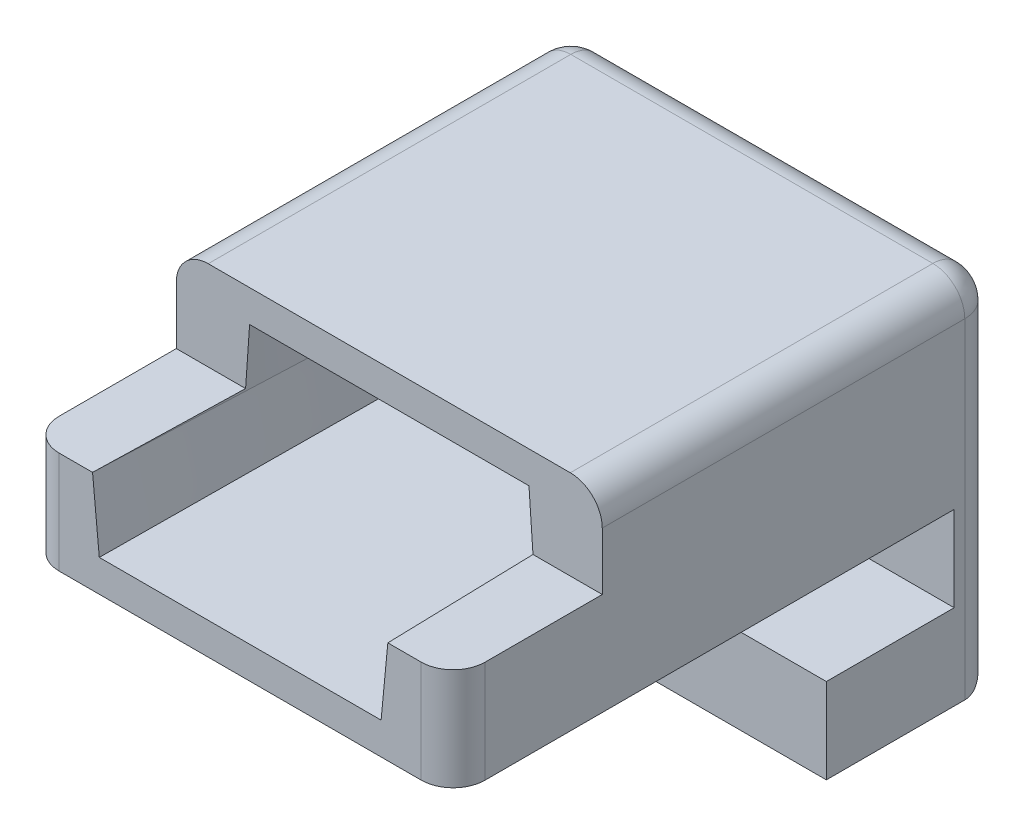
ISO-10303-21;
HEADER;
FILE_DESCRIPTION(('STEP AP214'),'2;1');
FILE_NAME('part.step','',(''),(''),'','','');
FILE_SCHEMA(('AUTOMOTIVE_DESIGN { 1 0 10303 214 1 1 1 1 }'));
ENDSEC;
DATA;
#1=APPLICATION_CONTEXT('core data for automotive mechanical design processes');
#2=APPLICATION_PROTOCOL_DEFINITION('international standard','automotive_design',2000,#1);
#3=PRODUCT_CONTEXT('',#1,'mechanical');
#4=PRODUCT('Part','Part','',(#3));
#5=PRODUCT_RELATED_PRODUCT_CATEGORY('part','',(#4));
#6=PRODUCT_DEFINITION_FORMATION('','',#4);
#7=PRODUCT_DEFINITION_CONTEXT('part definition',#1,'design');
#8=PRODUCT_DEFINITION('design','',#6,#7);
#9=PRODUCT_DEFINITION_SHAPE('','',#8);
#10=(LENGTH_UNIT() NAMED_UNIT(*) SI_UNIT(.MILLI.,.METRE.));
#11=(NAMED_UNIT(*) PLANE_ANGLE_UNIT() SI_UNIT($,.RADIAN.));
#12=(NAMED_UNIT(*) SI_UNIT($,.STERADIAN.) SOLID_ANGLE_UNIT());
#13=UNCERTAINTY_MEASURE_WITH_UNIT(LENGTH_MEASURE(1.E-05),#10,'distance_accuracy_value','');
#14=(GEOMETRIC_REPRESENTATION_CONTEXT(3) GLOBAL_UNCERTAINTY_ASSIGNED_CONTEXT((#13)) GLOBAL_UNIT_ASSIGNED_CONTEXT((#10,
#11,#12)) REPRESENTATION_CONTEXT('',''));
#15=CARTESIAN_POINT('',(0.,0.,0.));
#16=DIRECTION('',(0.,0.,1.));
#17=DIRECTION('',(1.,0.,0.));
#18=AXIS2_PLACEMENT_3D('',#15,#16,#17);
#19=CARTESIAN_POINT('',(31.75,28.575,29.36875));
#20=DIRECTION('',(-1.,0.,0.));
#21=DIRECTION('',(0.,0.,1.));
#22=AXIS2_PLACEMENT_3D('',#19,#20,#21);
#23=PLANE('',#22);
#24=DIRECTION('',(0.,0.,1.));
#25=VECTOR('',#24,1.);
#26=CARTESIAN_POINT('',(31.75,-25.4,-51.66233));
#27=LINE('',#26,#25);
#28=CARTESIAN_POINT('',(31.75,-25.4,-46.89983));
#29=VERTEX_POINT('',#28);
#30=CARTESIAN_POINT('',(31.75,-25.4,-26.26233));
#31=VERTEX_POINT('',#30);
#32=EDGE_CURVE('E247',#29,#31,#27,.T.);
#33=ORIENTED_EDGE('',*,*,#32,.F.);
#34=DIRECTION('',(0.,-1.,0.));
#35=VECTOR('',#34,1.);
#36=CARTESIAN_POINT('',(31.75,28.575,-46.89983));
#37=LINE('',#36,#35);
#38=CARTESIAN_POINT('',(31.75,23.8125,-46.89983));
#39=VERTEX_POINT('',#38);
#40=EDGE_CURVE('E14',#29,#39,#37,.F.);
#41=ORIENTED_EDGE('',*,*,#40,.T.);
#42=DIRECTION('',(0.,0.,-1.));
#43=VECTOR('',#42,1.);
#44=CARTESIAN_POINT('',(31.75,23.8125,29.36875));
#45=LINE('',#44,#43);
#46=CARTESIAN_POINT('',(31.75,23.8125,7.14374999999994));
#47=VERTEX_POINT('',#46);
#48=EDGE_CURVE('E72',#39,#47,#45,.F.);
#49=ORIENTED_EDGE('',*,*,#48,.T.);
#50=DIRECTION('',(0.,1.,0.));
#51=VECTOR('',#50,1.);
#52=CARTESIAN_POINT('',(31.75,-67.2770438188243,7.14375));
#53=LINE('',#52,#51);
#54=CARTESIAN_POINT('',(31.75,15.24,7.14375));
#55=VERTEX_POINT('',#54);
#56=EDGE_CURVE('E556',#55,#47,#53,.T.);
#57=ORIENTED_EDGE('',*,*,#56,.F.);
#58=DIRECTION('',(0.,0.,-1.));
#59=VECTOR('',#58,1.);
#60=CARTESIAN_POINT('',(31.75,15.24,7.14375));
#61=LINE('',#60,#59);
#62=CARTESIAN_POINT('',(31.75,15.24,24.60625));
#63=VERTEX_POINT('',#62);
#64=EDGE_CURVE('E394',#63,#55,#61,.T.);
#65=ORIENTED_EDGE('',*,*,#64,.F.);
#66=DIRECTION('',(0.,-1.,0.));
#67=VECTOR('',#66,1.);
#68=CARTESIAN_POINT('',(31.75,28.575,24.60625));
#69=LINE('',#68,#67);
#70=CARTESIAN_POINT('',(31.75,0.,24.60625));
#71=VERTEX_POINT('',#70);
#72=EDGE_CURVE('E382',#63,#71,#69,.T.);
#73=ORIENTED_EDGE('',*,*,#72,.T.);
#74=DIRECTION('',(0.,0.,-1.));
#75=VECTOR('',#74,1.);
#76=CARTESIAN_POINT('',(31.75,0.,29.36875));
#77=LINE('',#76,#75);
#78=CARTESIAN_POINT('',(31.75,0.,-45.31233));
#79=VERTEX_POINT('',#78);
#80=EDGE_CURVE('E252',#71,#79,#77,.T.);
#81=ORIENTED_EDGE('',*,*,#80,.T.);
#82=DIRECTION('',(0.,-1.,0.));
#83=VECTOR('',#82,1.);
#84=CARTESIAN_POINT('',(31.75,0.,-45.31233));
#85=LINE('',#84,#83);
#86=CARTESIAN_POINT('',(31.75,-12.7,-45.31233));
#87=VERTEX_POINT('',#86);
#88=EDGE_CURVE('E234',#79,#87,#85,.T.);
#89=ORIENTED_EDGE('',*,*,#88,.T.);
#90=DIRECTION('',(0.,0.,1.));
#91=VECTOR('',#90,1.);
#92=CARTESIAN_POINT('',(31.75,-12.7,-45.31233));
#93=LINE('',#92,#91);
#94=CARTESIAN_POINT('',(31.75,-12.7,-26.26233));
#95=VERTEX_POINT('',#94);
#96=EDGE_CURVE('E241',#87,#95,#93,.T.);
#97=ORIENTED_EDGE('',*,*,#96,.T.);
#98=DIRECTION('',(0.,1.,0.));
#99=VECTOR('',#98,1.);
#100=CARTESIAN_POINT('',(31.75,-25.4,-26.26233));
#101=LINE('',#100,#99);
#102=EDGE_CURVE('E270',#31,#95,#101,.T.);
#103=ORIENTED_EDGE('',*,*,#102,.F.);
#104=EDGE_LOOP('',(#33,#41,#49,#57,#65,#73,#81,#89,#97,#103));
#105=FACE_BOUND('',#104,.T.);
#106=ADVANCED_FACE('F63',(#105),#23,.F.);
#107=CARTESIAN_POINT('',(-31.75,28.575,29.36875));
#108=DIRECTION('',(1.,0.,0.));
#109=DIRECTION('',(0.,0.,-1.));
#110=AXIS2_PLACEMENT_3D('',#107,#108,#109);
#111=PLANE('',#110);
#112=DIRECTION('',(0.,0.,1.));
#113=VECTOR('',#112,1.);
#114=CARTESIAN_POINT('',(-31.75,23.8125,29.36875));
#115=LINE('',#114,#113);
#116=CARTESIAN_POINT('',(-31.75,23.8125,7.14374999999994));
#117=VERTEX_POINT('',#116);
#118=CARTESIAN_POINT('',(-31.75,23.8125,-46.89983));
#119=VERTEX_POINT('',#118);
#120=EDGE_CURVE('E426',#117,#119,#115,.F.);
#121=ORIENTED_EDGE('',*,*,#120,.T.);
#122=DIRECTION('',(0.,1.,0.));
#123=VECTOR('',#122,1.);
#124=CARTESIAN_POINT('',(-31.75,-25.4,-46.89983));
#125=LINE('',#124,#123);
#126=CARTESIAN_POINT('',(-31.75,-25.4,-46.89983));
#127=VERTEX_POINT('',#126);
#128=EDGE_CURVE('E428',#119,#127,#125,.F.);
#129=ORIENTED_EDGE('',*,*,#128,.T.);
#130=DIRECTION('',(0.,0.,-1.));
#131=VECTOR('',#130,1.);
#132=CARTESIAN_POINT('',(-31.75,-25.4,-51.66233));
#133=LINE('',#132,#131);
#134=CARTESIAN_POINT('',(-31.75,-25.4,-26.26233));
#135=VERTEX_POINT('',#134);
#136=EDGE_CURVE('E264',#135,#127,#133,.T.);
#137=ORIENTED_EDGE('',*,*,#136,.F.);
#138=DIRECTION('',(0.,1.,0.));
#139=VECTOR('',#138,1.);
#140=CARTESIAN_POINT('',(-31.75,-25.4,-26.26233));
#141=LINE('',#140,#139);
#142=CARTESIAN_POINT('',(-31.75,-12.7,-26.26233));
#143=VERTEX_POINT('',#142);
#144=EDGE_CURVE('E267',#135,#143,#141,.T.);
#145=ORIENTED_EDGE('',*,*,#144,.T.);
#146=DIRECTION('',(0.,0.,1.));
#147=VECTOR('',#146,1.);
#148=CARTESIAN_POINT('',(-31.75,-12.7,-45.31233));
#149=LINE('',#148,#147);
#150=CARTESIAN_POINT('',(-31.75,-12.7,-45.31233));
#151=VERTEX_POINT('',#150);
#152=EDGE_CURVE('E248',#151,#143,#149,.T.);
#153=ORIENTED_EDGE('',*,*,#152,.F.);
#154=DIRECTION('',(0.,1.,0.));
#155=VECTOR('',#154,1.);
#156=CARTESIAN_POINT('',(-31.75,-12.7,-45.31233));
#157=LINE('',#156,#155);
#158=CARTESIAN_POINT('',(-31.75,0.,-45.31233));
#159=VERTEX_POINT('',#158);
#160=EDGE_CURVE('E236',#151,#159,#157,.T.);
#161=ORIENTED_EDGE('',*,*,#160,.T.);
#162=DIRECTION('',(0.,0.,1.));
#163=VECTOR('',#162,1.);
#164=CARTESIAN_POINT('',(-31.75,0.,29.36875));
#165=LINE('',#164,#163);
#166=CARTESIAN_POINT('',(-31.75,0.,24.60625));
#167=VERTEX_POINT('',#166);
#168=EDGE_CURVE('E485',#159,#167,#165,.T.);
#169=ORIENTED_EDGE('',*,*,#168,.T.);
#170=DIRECTION('',(0.,-1.,0.));
#171=VECTOR('',#170,1.);
#172=CARTESIAN_POINT('',(-31.75,28.575,24.60625));
#173=LINE('',#172,#171);
#174=CARTESIAN_POINT('',(-31.75,15.24,24.60625));
#175=VERTEX_POINT('',#174);
#176=EDGE_CURVE('E410',#167,#175,#173,.F.);
#177=ORIENTED_EDGE('',*,*,#176,.T.);
#178=DIRECTION('',(0.,0.,1.));
#179=VECTOR('',#178,1.);
#180=CARTESIAN_POINT('',(-31.75,15.24,7.14375));
#181=LINE('',#180,#179);
#182=CARTESIAN_POINT('',(-31.75,15.24,7.14375));
#183=VERTEX_POINT('',#182);
#184=EDGE_CURVE('E388',#183,#175,#181,.T.);
#185=ORIENTED_EDGE('',*,*,#184,.F.);
#186=DIRECTION('',(0.,1.,0.));
#187=VECTOR('',#186,1.);
#188=CARTESIAN_POINT('',(-31.75,-67.2770438188243,7.14375));
#189=LINE('',#188,#187);
#190=EDGE_CURVE('E553',#183,#117,#189,.T.);
#191=ORIENTED_EDGE('',*,*,#190,.T.);
#192=EDGE_LOOP('',(#121,#129,#137,#145,#153,#161,#169,#177,#185,#191));
#193=FACE_BOUND('',#192,.T.);
#194=ADVANCED_FACE('F475',(#193),#111,.F.);
#195=CARTESIAN_POINT('',(31.75,-25.4,-26.26233));
#196=DIRECTION('',(0.,0.,-1.));
#197=DIRECTION('',(-1.,0.,0.));
#198=AXIS2_PLACEMENT_3D('',#195,#196,#197);
#199=PLANE('',#198);
#200=DIRECTION('',(-1.,0.,0.));
#201=VECTOR('',#200,1.);
#202=CARTESIAN_POINT('',(31.75,-12.7,-26.26233));
#203=LINE('',#202,#201);
#204=EDGE_CURVE('E244',#95,#143,#203,.T.);
#205=ORIENTED_EDGE('',*,*,#204,.T.);
#206=ORIENTED_EDGE('',*,*,#144,.F.);
#207=DIRECTION('',(-1.,0.,0.));
#208=VECTOR('',#207,1.);
#209=CARTESIAN_POINT('',(31.75,-25.4,-26.26233));
#210=LINE('',#209,#208);
#211=EDGE_CURVE('E262',#31,#135,#210,.T.);
#212=ORIENTED_EDGE('',*,*,#211,.F.);
#213=ORIENTED_EDGE('',*,*,#102,.T.);
#214=EDGE_LOOP('',(#205,#206,#212,#213));
#215=FACE_BOUND('',#214,.T.);
#216=ADVANCED_FACE('F483',(#215),#199,.F.);
#217=CARTESIAN_POINT('',(0.,15.24,0.));
#218=DIRECTION('',(0.,-1.,0.));
#219=DIRECTION('',(0.,0.,-1.));
#220=AXIS2_PLACEMENT_3D('',#217,#218,#219);
#221=PLANE('',#220);
#222=DIRECTION('',(1.,0.,0.));
#223=VECTOR('',#222,1.);
#224=CARTESIAN_POINT('',(-31.75,15.24,29.36875));
#225=LINE('',#224,#223);
#226=CARTESIAN_POINT('',(22.0091,15.24,29.36875));
#227=VERTEX_POINT('',#226);
#228=CARTESIAN_POINT('',(26.9875,15.24,29.36875));
#229=VERTEX_POINT('',#228);
#230=EDGE_CURVE('E383',#227,#229,#225,.T.);
#231=ORIENTED_EDGE('',*,*,#230,.T.);
#232=CARTESIAN_POINT('',(26.9875,15.24,24.60625));
#233=DIRECTION('',(0.,-1.,0.));
#234=DIRECTION('',(0.,0.,-1.));
#235=AXIS2_PLACEMENT_3D('',#232,#233,#234);
#236=CIRCLE('',#235,4.7625);
#237=EDGE_CURVE('E408',#229,#63,#236,.F.);
#238=ORIENTED_EDGE('',*,*,#237,.T.);
#239=ORIENTED_EDGE('',*,*,#64,.T.);
#240=DIRECTION('',(-1.,0.,0.));
#241=VECTOR('',#240,1.);
#242=CARTESIAN_POINT('',(-31.75,15.24,7.14375));
#243=LINE('',#242,#241);
#244=CARTESIAN_POINT('',(21.4217049692344,15.24,7.14375));
#245=VERTEX_POINT('',#244);
#246=EDGE_CURVE('E551',#55,#245,#243,.T.);
#247=ORIENTED_EDGE('',*,*,#246,.T.);
#248=CARTESIAN_POINT('',(21.4217049692344,15.24,7.14375));
#249=CARTESIAN_POINT('',(21.5032600398479,15.24,10.3177035377856));
#250=CARTESIAN_POINT('',(21.5857706019446,15.24,13.4916326566718));
#251=CARTESIAN_POINT('',(21.7528116917226,15.24,19.8394369407282));
#252=CARTESIAN_POINT('',(21.8373422189032,15.24,23.0133121059116));
#253=CARTESIAN_POINT('',(21.9515386265982,15.24,27.2476922520784));
#254=CARTESIAN_POINT('',(21.9802588686799,15.24,28.3082227713538));
#255=CARTESIAN_POINT('',(22.0091,15.24,29.36875));
#256=B_SPLINE_CURVE_WITH_KNOTS('',3,(#248,#249,#250,#251,#252,#253,#254,#255),.UNSPECIFIED.,.F.,
.F.,(4,2,2,4),(0.,9.52500352563981,19.0500046905378,22.2327626687833),.UNSPECIFIED.);
#257=EDGE_CURVE('E316',#245,#227,#256,.T.);
#258=ORIENTED_EDGE('',*,*,#257,.T.);
#259=EDGE_LOOP('',(#231,#238,#239,#247,#258));
#260=FACE_BOUND('',#259,.T.);
#261=ADVANCED_FACE('F561',(#260),#221,.F.);
#262=CARTESIAN_POINT('',(-31.75,28.575,29.36875));
#263=DIRECTION('',(0.,0.,-1.));
#264=DIRECTION('',(-1.,0.,0.));
#265=AXIS2_PLACEMENT_3D('',#262,#263,#264);
#266=PLANE('',#265);
#267=DIRECTION('',(1.,0.,0.));
#268=VECTOR('',#267,1.);
#269=CARTESIAN_POINT('',(-31.75,0.,29.36875));
#270=LINE('',#269,#268);
#271=CARTESIAN_POINT('',(-26.9875,0.,29.36875));
#272=VERTEX_POINT('',#271);
#273=CARTESIAN_POINT('',(26.9875,0.,29.36875));
#274=VERTEX_POINT('',#273);
#275=EDGE_CURVE('E364',#272,#274,#270,.T.);
#276=ORIENTED_EDGE('',*,*,#275,.T.);
#277=DIRECTION('',(0.,-1.,0.));
#278=VECTOR('',#277,1.);
#279=CARTESIAN_POINT('',(26.9875,28.575,29.36875));
#280=LINE('',#279,#278);
#281=EDGE_CURVE('E406',#274,#229,#280,.F.);
#282=ORIENTED_EDGE('',*,*,#281,.T.);
#283=ORIENTED_EDGE('',*,*,#230,.F.);
#284=DIRECTION('',(0.0953215469228855,0.995446534321271,0.));
#285=VECTOR('',#284,1.);
#286=CARTESIAN_POINT('',(21.0058,4.76249999999998,29.36875));
#287=LINE('',#286,#285);
#288=CARTESIAN_POINT('',(21.0058,4.76249999999998,29.36875));
#289=VERTEX_POINT('',#288);
#290=EDGE_CURVE('E389',#289,#227,#287,.T.);
#291=ORIENTED_EDGE('',*,*,#290,.F.);
#292=DIRECTION('',(1.,0.,0.));
#293=VECTOR('',#292,1.);
#294=CARTESIAN_POINT('',(-21.0058,4.76249999999998,29.36875));
#295=LINE('',#294,#293);
#296=CARTESIAN_POINT('',(-21.0058,4.76249999999998,29.36875));
#297=VERTEX_POINT('',#296);
#298=EDGE_CURVE('E299',#297,#289,#295,.T.);
#299=ORIENTED_EDGE('',*,*,#298,.F.);
#300=DIRECTION('',(0.0953215469228855,-0.995446534321271,0.));
#301=VECTOR('',#300,1.);
#302=CARTESIAN_POINT('',(-21.0058,4.76249999999998,29.36875));
#303=LINE('',#302,#301);
#304=CARTESIAN_POINT('',(-22.0091,15.24,29.36875));
#305=VERTEX_POINT('',#304);
#306=EDGE_CURVE('E505',#305,#297,#303,.T.);
#307=ORIENTED_EDGE('',*,*,#306,.F.);
#308=CARTESIAN_POINT('',(-26.9875,15.24,29.36875));
#309=VERTEX_POINT('',#308);
#310=EDGE_CURVE('E387',#309,#305,#225,.T.);
#311=ORIENTED_EDGE('',*,*,#310,.F.);
#312=DIRECTION('',(0.,-1.,0.));
#313=VECTOR('',#312,1.);
#314=CARTESIAN_POINT('',(-26.9875,28.575,29.36875));
#315=LINE('',#314,#313);
#316=EDGE_CURVE('E403',#309,#272,#315,.T.);
#317=ORIENTED_EDGE('',*,*,#316,.T.);
#318=EDGE_LOOP('',(#276,#282,#283,#291,#299,#307,#311,#317));
#319=FACE_BOUND('',#318,.T.);
#320=ADVANCED_FACE('F501',(#319),#266,.F.);
#321=CARTESIAN_POINT('',(0.,28.575,0.));
#322=DIRECTION('',(0.,-1.,0.));
#323=DIRECTION('',(0.,0.,-1.));
#324=AXIS2_PLACEMENT_3D('',#321,#322,#323);
#325=PLANE('',#324);
#326=DIRECTION('',(1.,0.,0.));
#327=VECTOR('',#326,1.);
#328=CARTESIAN_POINT('',(-31.75,28.575,-46.89983));
#329=LINE('',#328,#327);
#330=CARTESIAN_POINT('',(26.9875,28.575,-46.89983));
#331=VERTEX_POINT('',#330);
#332=CARTESIAN_POINT('',(-26.9875,28.575,-46.89983));
#333=VERTEX_POINT('',#332);
#334=EDGE_CURVE('E432',#331,#333,#329,.F.);
#335=ORIENTED_EDGE('',*,*,#334,.T.);
#336=DIRECTION('',(0.,0.,1.));
#337=VECTOR('',#336,1.);
#338=CARTESIAN_POINT('',(-26.9875,28.575,0.));
#339=LINE('',#338,#337);
#340=CARTESIAN_POINT('',(-26.9875,28.575,7.14375));
#341=VERTEX_POINT('',#340);
#342=EDGE_CURVE('E434',#333,#341,#339,.T.);
#343=ORIENTED_EDGE('',*,*,#342,.T.);
#344=DIRECTION('',(-1.,0.,0.));
#345=VECTOR('',#344,1.);
#346=CARTESIAN_POINT('',(-31.75,28.575,7.14375));
#347=LINE('',#346,#345);
#348=CARTESIAN_POINT('',(26.9875,28.575,7.14375));
#349=VERTEX_POINT('',#348);
#350=EDGE_CURVE('E552',#349,#341,#347,.T.);
#351=ORIENTED_EDGE('',*,*,#350,.F.);
#352=DIRECTION('',(0.,0.,-1.));
#353=VECTOR('',#352,1.);
#354=CARTESIAN_POINT('',(26.9875,28.575,0.));
#355=LINE('',#354,#353);
#356=EDGE_CURVE('E430',#349,#331,#355,.T.);
#357=ORIENTED_EDGE('',*,*,#356,.T.);
#358=EDGE_LOOP('',(#335,#343,#351,#357));
#359=FACE_BOUND('',#358,.T.);
#360=ADVANCED_FACE('F640',(#359),#325,.F.);
#361=CARTESIAN_POINT('',(0.,0.,0.));
#362=DIRECTION('',(0.,-1.,0.));
#363=DIRECTION('',(0.,0.,-1.));
#364=AXIS2_PLACEMENT_3D('',#361,#362,#363);
#365=PLANE('',#364);
#366=ORIENTED_EDGE('',*,*,#80,.F.);
#367=CARTESIAN_POINT('',(26.9875,0.,24.60625));
#368=DIRECTION('',(0.,-1.,0.));
#369=DIRECTION('',(0.,0.,-1.));
#370=AXIS2_PLACEMENT_3D('',#367,#368,#369);
#371=CIRCLE('',#370,4.7625);
#372=EDGE_CURVE('E401',#71,#274,#371,.T.);
#373=ORIENTED_EDGE('',*,*,#372,.T.);
#374=ORIENTED_EDGE('',*,*,#275,.F.);
#375=CARTESIAN_POINT('',(-26.9875,0.,24.60625));
#376=DIRECTION('',(0.,-1.,0.));
#377=DIRECTION('',(0.,0.,-1.));
#378=AXIS2_PLACEMENT_3D('',#375,#376,#377);
#379=CIRCLE('',#378,4.7625);
#380=EDGE_CURVE('E494',#272,#167,#379,.T.);
#381=ORIENTED_EDGE('',*,*,#380,.T.);
#382=ORIENTED_EDGE('',*,*,#168,.F.);
#383=DIRECTION('',(1.,0.,0.));
#384=VECTOR('',#383,1.);
#385=CARTESIAN_POINT('',(-31.75,0.,-45.31233));
#386=LINE('',#385,#384);
#387=EDGE_CURVE('E258',#159,#79,#386,.T.);
#388=ORIENTED_EDGE('',*,*,#387,.T.);
#389=EDGE_LOOP('',(#366,#373,#374,#381,#382,#388));
#390=FACE_BOUND('',#389,.T.);
#391=ADVANCED_FACE('F650',(#390),#365,.T.);
#392=ORIENTED_EDGE('',*,*,#184,.T.);
#393=CARTESIAN_POINT('',(-26.9875,15.24,24.60625));
#394=DIRECTION('',(0.,-1.,0.));
#395=DIRECTION('',(0.,0.,-1.));
#396=AXIS2_PLACEMENT_3D('',#393,#394,#395);
#397=CIRCLE('',#396,4.7625);
#398=EDGE_CURVE('E412',#175,#309,#397,.F.);
#399=ORIENTED_EDGE('',*,*,#398,.T.);
#400=ORIENTED_EDGE('',*,*,#310,.T.);
#401=CARTESIAN_POINT('',(-22.0091,15.24,29.36875));
#402=CARTESIAN_POINT('',(-21.9227886213007,15.24,26.1949220887347));
#403=CARTESIAN_POINT('',(-21.8375584750906,15.24,23.0210648125797));
#404=CARTESIAN_POINT('',(-21.6691541888226,15.24,16.6732964458658));
#405=CARTESIAN_POINT('',(-21.5859800482842,15.24,13.4993853553197));
#406=CARTESIAN_POINT('',(-21.4763139235597,15.24,9.2648855024364));
#407=CARTESIAN_POINT('',(-21.4489560216459,15.24,8.20431911865208));
#408=CARTESIAN_POINT('',(-21.4217049692344,15.24,7.14375));
#409=B_SPLINE_CURVE_WITH_KNOTS('',3,(#401,#402,#403,#404,#405,#406,#407,#408),.UNSPECIFIED.,.F.,
.F.,(4,2,2,4),(0.,9.52500368368208,19.0500051412578,22.2327626584923),.UNSPECIFIED.);
#410=CARTESIAN_POINT('',(-21.4217049692344,15.24,7.14375));
#411=VERTEX_POINT('',#410);
#412=EDGE_CURVE('E313',#305,#411,#409,.T.);
#413=ORIENTED_EDGE('',*,*,#412,.T.);
#414=EDGE_CURVE('E549',#411,#183,#243,.T.);
#415=ORIENTED_EDGE('',*,*,#414,.T.);
#416=EDGE_LOOP('',(#392,#399,#400,#413,#415));
#417=FACE_BOUND('',#416,.T.);
#418=ADVANCED_FACE('F327',(#417),#221,.F.);
#419=CARTESIAN_POINT('',(-31.75,-67.2770438188243,7.14375));
#420=DIRECTION('',(0.,0.,-1.));
#421=DIRECTION('',(-1.,0.,0.));
#422=AXIS2_PLACEMENT_3D('',#419,#420,#421);
#423=PLANE('',#422);
#424=ORIENTED_EDGE('',*,*,#350,.T.);
#425=CARTESIAN_POINT('',(-26.9875,23.8125,7.14375000000006));
#426=DIRECTION('',(0.,0.,-1.));
#427=DIRECTION('',(0.,1.,0.));
#428=AXIS2_PLACEMENT_3D('',#425,#426,#427);
#429=CIRCLE('',#428,4.7625);
#430=EDGE_CURVE('E438',#341,#117,#429,.F.);
#431=ORIENTED_EDGE('',*,*,#430,.T.);
#432=ORIENTED_EDGE('',*,*,#190,.F.);
#433=ORIENTED_EDGE('',*,*,#414,.F.);
#434=CARTESIAN_POINT('',(-21.4217049692344,15.24,7.14375));
#435=CARTESIAN_POINT('',(-21.3664219162519,16.0318224842431,7.14375));
#436=CARTESIAN_POINT('',(-21.3111388632694,16.8236449684862,7.14375));
#437=CARTESIAN_POINT('',(-21.2005727573043,18.4072899369725,7.14375));
#438=CARTESIAN_POINT('',(-21.1452897043218,19.1991124212156,7.14375));
#439=CARTESIAN_POINT('',(-21.0010692990911,21.2647899369725,7.14375));
#440=CARTESIAN_POINT('',(-20.9121319468429,22.5386449684862,7.14375));
#441=CARTESIAN_POINT('',(-20.8231945945946,23.8125,7.14375));
#442=B_SPLINE_CURVE_WITH_KNOTS('',3,(#434,#435,#436,#437,#438,#439,#440,#441),.UNSPECIFIED.,.F.,
.F.,(4,2,2,4),(0.,2.38125000000004,4.76250000000007,8.593367844946),.UNSPECIFIED.);
#443=CARTESIAN_POINT('',(-20.8231945945946,23.8125,7.14375));
#444=VERTEX_POINT('',#443);
#445=EDGE_CURVE('E355',#411,#444,#442,.T.);
#446=ORIENTED_EDGE('',*,*,#445,.T.);
#447=DIRECTION('',(1.,0.,0.));
#448=VECTOR('',#447,1.);
#449=CARTESIAN_POINT('',(-31.75,23.8125,7.14375));
#450=LINE('',#449,#448);
#451=CARTESIAN_POINT('',(20.8231945945946,23.8125,7.14375));
#452=VERTEX_POINT('',#451);
#453=EDGE_CURVE('E363',#444,#452,#450,.T.);
#454=ORIENTED_EDGE('',*,*,#453,.T.);
#455=CARTESIAN_POINT('',(20.8231945945946,23.8125,7.14375));
#456=CARTESIAN_POINT('',(20.8784776475771,23.0206775157569,7.14375));
#457=CARTESIAN_POINT('',(20.9337607005596,22.2288550315138,7.14375));
#458=CARTESIAN_POINT('',(21.0443268065246,20.6452100630275,7.14375));
#459=CARTESIAN_POINT('',(21.0996098595071,19.8533875787844,7.14375));
#460=CARTESIAN_POINT('',(21.2438302647379,17.7877100630275,7.14375));
#461=CARTESIAN_POINT('',(21.3327676169861,16.5138550315137,7.14375));
#462=CARTESIAN_POINT('',(21.4217049692344,15.24,7.14375));
#463=B_SPLINE_CURVE_WITH_KNOTS('',3,(#455,#456,#457,#458,#459,#460,#461,#462),.UNSPECIFIED.,.F.,
.F.,(4,2,2,4),(0.,2.38125000000004,4.76250000000008,8.59336784494601),.UNSPECIFIED.);
#464=EDGE_CURVE('E375',#452,#245,#463,.T.);
#465=ORIENTED_EDGE('',*,*,#464,.T.);
#466=ORIENTED_EDGE('',*,*,#246,.F.);
#467=ORIENTED_EDGE('',*,*,#56,.T.);
#468=CARTESIAN_POINT('',(26.9875,23.8125,7.14375000000006));
#469=DIRECTION('',(0.,0.,-1.));
#470=DIRECTION('',(0.,1.,0.));
#471=AXIS2_PLACEMENT_3D('',#468,#469,#470);
#472=CIRCLE('',#471,4.7625);
#473=EDGE_CURVE('E436',#47,#349,#472,.F.);
#474=ORIENTED_EDGE('',*,*,#473,.T.);
#475=EDGE_LOOP('',(#424,#431,#432,#433,#446,#454,#465,#466,#467,#474));
#476=FACE_BOUND('',#475,.T.);
#477=ADVANCED_FACE('F367',(#476),#423,.F.);
#478=CARTESIAN_POINT('',(21.0058,23.8125,29.36875));
#479=CARTESIAN_POINT('',(20.8449333333333,23.8125,9.78958333333335));
#480=CARTESIAN_POINT('',(20.6840666666667,23.8125,-9.78958333333335));
#481=CARTESIAN_POINT('',(20.5232,23.8125,-29.36875));
#482=CARTESIAN_POINT('',(21.0894083333333,23.098125,29.36875));
#483=CARTESIAN_POINT('',(20.9006722222222,23.0716666666667,9.78958333333335));
#484=CARTESIAN_POINT('',(20.7119361111111,23.0452083333333,-9.78958333333335));
#485=CARTESIAN_POINT('',(20.5232,23.01875,-29.36875));
#486=CARTESIAN_POINT('',(21.256625,21.6693749999999,29.36875));
#487=CARTESIAN_POINT('',(21.01215,21.59,9.78958333333335));
#488=CARTESIAN_POINT('',(20.767675,21.510625,-9.78958333333335));
#489=CARTESIAN_POINT('',(20.5232,21.43125,-29.36875));
#490=CARTESIAN_POINT('',(21.50745,19.52625,29.36875));
#491=CARTESIAN_POINT('',(21.1793666666667,19.3675,9.78958333333335));
#492=CARTESIAN_POINT('',(20.8512833333333,19.20875,-9.78958333333335));
#493=CARTESIAN_POINT('',(20.5232,19.05,-29.36875));
#494=CARTESIAN_POINT('',(21.758275,17.383125,29.36875));
#495=CARTESIAN_POINT('',(21.3465833333333,17.145,9.78958333333335));
#496=CARTESIAN_POINT('',(20.9348916666667,16.906875,-9.78958333333335));
#497=CARTESIAN_POINT('',(20.5232,16.66875,-29.36875));
#498=CARTESIAN_POINT('',(21.9254916666667,15.954375,29.36875));
#499=CARTESIAN_POINT('',(21.4580611111111,15.6633333333333,9.78958333333335));
#500=CARTESIAN_POINT('',(20.9906305555556,15.3722916666667,-9.78958333333335));
#501=CARTESIAN_POINT('',(20.5232,15.08125,-29.36875));
#502=CARTESIAN_POINT('',(22.0091,15.24,29.36875));
#503=CARTESIAN_POINT('',(21.5138,14.9225,9.78958333333335));
#504=CARTESIAN_POINT('',(21.0185,14.605,-9.78958333333335));
#505=CARTESIAN_POINT('',(20.5232,14.2875,-29.36875));
#506=B_SPLINE_SURFACE_WITH_KNOTS('',3,3,((#478,#479,#480,#481),(#482,#483,#484,#485),(#486,#487,
#488,#489),(#490,#491,#492,#493),(#494,#495,#496,#497),(#498,#499,#500,#501),(#502,#503,#504,
#505)),.UNSPECIFIED.,.F.,.F.,.F.,(4,1,1,1,4),(4,4),(0.847844497468553,0.885883373101415,
0.923922248734276,0.961961124367138,1.),(0.,1.),.UNSPECIFIED.);
#507=DIRECTION('',(-0.00821593890745194,0.,-0.999966248604356));
#508=VECTOR('',#507,1.);
#509=CARTESIAN_POINT('',(20.7645,23.8125,0.));
#510=LINE('',#509,#508);
#511=CARTESIAN_POINT('',(20.5232,23.8125,-29.36875));
#512=VERTEX_POINT('',#511);
#513=EDGE_CURVE('E310',#452,#512,#510,.T.);
#514=DIRECTION('',(0.,-1.,0.));
#515=VECTOR('',#514,1.);
#516=CARTESIAN_POINT('',(20.5232,4.76250000000002,-29.36875));
#517=LINE('',#516,#515);
#518=CARTESIAN_POINT('',(20.5232,14.2875,-29.36875));
#519=VERTEX_POINT('',#518);
#520=EDGE_CURVE('E317',#512,#519,#517,.T.);
#521=DIRECTION('',(-0.0252858843212964,-0.0162089002059585,-0.999548846034151));
#522=VECTOR('',#521,1.);
#523=CARTESIAN_POINT('',(21.26615,14.76375,0.));
#524=LINE('',#523,#522);
#525=EDGE_CURVE('E287',#227,#519,#524,.T.);
#526=ORIENTED_EDGE('',*,*,#464,.F.);
#527=ORIENTED_EDGE('',*,*,#513,.T.);
#528=ORIENTED_EDGE('',*,*,#520,.T.);
#529=ORIENTED_EDGE('',*,*,#525,.F.);
#530=ORIENTED_EDGE('',*,*,#257,.F.);
#531=EDGE_LOOP('',(#526,#527,#528,#529,#530));
#532=FACE_BOUND('',#531,.T.);
#533=ADVANCED_FACE('F343',(#532),#506,.F.);
#534=CARTESIAN_POINT('',(-21.0058,23.8125,29.36875));
#535=DIRECTION('',(0.,1.,0.));
#536=DIRECTION('',(1.,0.,0.));
#537=AXIS2_PLACEMENT_3D('',#534,#535,#536);
#538=PLANE('',#537);
#539=DIRECTION('',(0.00821593890745177,0.,-0.999966248604356));
#540=VECTOR('',#539,1.);
#541=CARTESIAN_POINT('',(-20.7645,23.8125,0.));
#542=LINE('',#541,#540);
#543=CARTESIAN_POINT('',(-20.5232,23.8125,-29.36875));
#544=VERTEX_POINT('',#543);
#545=EDGE_CURVE('E298',#444,#544,#542,.T.);
#546=ORIENTED_EDGE('',*,*,#545,.T.);
#547=DIRECTION('',(0.,0.,1.));
#548=VECTOR('',#547,1.);
#549=CARTESIAN_POINT('',(-20.5232,23.8125,-35.71875));
#550=LINE('',#549,#548);
#551=CARTESIAN_POINT('',(-20.5232,23.8125,-35.71875));
#552=VERTEX_POINT('',#551);
#553=EDGE_CURVE('E511',#552,#544,#550,.T.);
#554=ORIENTED_EDGE('',*,*,#553,.F.);
#555=DIRECTION('',(-1.,0.,0.));
#556=VECTOR('',#555,1.);
#557=CARTESIAN_POINT('',(20.5232,23.8125,-35.71875));
#558=LINE('',#557,#556);
#559=CARTESIAN_POINT('',(20.5232,23.8125,-35.71875));
#560=VERTEX_POINT('',#559);
#561=EDGE_CURVE('E277',#560,#552,#558,.T.);
#562=ORIENTED_EDGE('',*,*,#561,.F.);
#563=DIRECTION('',(0.,0.,1.));
#564=VECTOR('',#563,1.);
#565=CARTESIAN_POINT('',(20.5232,23.8125,-35.71875));
#566=LINE('',#565,#564);
#567=EDGE_CURVE('E543',#560,#512,#566,.T.);
#568=ORIENTED_EDGE('',*,*,#567,.T.);
#569=ORIENTED_EDGE('',*,*,#513,.F.);
#570=ORIENTED_EDGE('',*,*,#453,.F.);
#571=EDGE_LOOP('',(#546,#554,#562,#568,#569,#570));
#572=FACE_BOUND('',#571,.T.);
#573=ADVANCED_FACE('F339',(#572),#538,.F.);
#574=CARTESIAN_POINT('',(-22.0091,15.24,29.36875));
#575=CARTESIAN_POINT('',(-21.5138,14.9225,9.78958333333335));
#576=CARTESIAN_POINT('',(-21.0185,14.605,-9.78958333333335));
#577=CARTESIAN_POINT('',(-20.5232,14.2875,-29.36875));
#578=CARTESIAN_POINT('',(-21.9254916666667,15.954375,29.36875));
#579=CARTESIAN_POINT('',(-21.4580611111111,15.6633333333333,9.78958333333335));
#580=CARTESIAN_POINT('',(-20.9906305555556,15.3722916666667,-9.78958333333335));
#581=CARTESIAN_POINT('',(-20.5232,15.08125,-29.36875));
#582=CARTESIAN_POINT('',(-21.758275,17.383125,29.3687500000001));
#583=CARTESIAN_POINT('',(-21.3465833333333,17.145,9.78958333333335));
#584=CARTESIAN_POINT('',(-20.9348916666667,16.906875,-9.78958333333335));
#585=CARTESIAN_POINT('',(-20.5232,16.66875,-29.3687500000001));
#586=CARTESIAN_POINT('',(-21.50745,19.52625,29.3687499999999));
#587=CARTESIAN_POINT('',(-21.1793666666667,19.3675,9.7895833333333));
#588=CARTESIAN_POINT('',(-20.8512833333333,19.20875,-9.7895833333333));
#589=CARTESIAN_POINT('',(-20.5232,19.05,-29.3687499999999));
#590=CARTESIAN_POINT('',(-21.256625,21.669375,29.36875));
#591=CARTESIAN_POINT('',(-21.01215,21.59,9.78958333333335));
#592=CARTESIAN_POINT('',(-20.767675,21.510625,-9.78958333333335));
#593=CARTESIAN_POINT('',(-20.5232,21.43125,-29.36875));
#594=CARTESIAN_POINT('',(-21.0894083333333,23.098125,29.36875));
#595=CARTESIAN_POINT('',(-20.9006722222222,23.0716666666667,9.78958333333335));
#596=CARTESIAN_POINT('',(-20.7119361111111,23.0452083333333,-9.78958333333335));
#597=CARTESIAN_POINT('',(-20.5232,23.01875,-29.36875));
#598=CARTESIAN_POINT('',(-21.0058,23.8125,29.36875));
#599=CARTESIAN_POINT('',(-20.8449333333333,23.8125,9.78958333333335));
#600=CARTESIAN_POINT('',(-20.6840666666667,23.8125,-9.78958333333335));
#601=CARTESIAN_POINT('',(-20.5232,23.8125,-29.36875));
#602=B_SPLINE_SURFACE_WITH_KNOTS('',3,3,((#574,#575,#576,#577),(#578,#579,#580,#581),(#582,#583,
#584,#585),(#586,#587,#588,#589),(#590,#591,#592,#593),(#594,#595,#596,#597),(#598,#599,#600,
#601)),.UNSPECIFIED.,.F.,.F.,.F.,(4,1,1,1,4),(4,4),(0.,0.0380388756328618,0.0760777512657237,
0.114116626898585,0.152155502531447),(0.,1.),.UNSPECIFIED.);
#603=DIRECTION('',(0.0252858843212964,-0.0162089002059587,-0.999548846034151));
#604=VECTOR('',#603,1.);
#605=CARTESIAN_POINT('',(-21.26615,14.76375,0.));
#606=LINE('',#605,#604);
#607=CARTESIAN_POINT('',(-20.5232,14.2875,-29.36875));
#608=VERTEX_POINT('',#607);
#609=EDGE_CURVE('E295',#305,#608,#606,.T.);
#610=DIRECTION('',(0.,1.,0.));
#611=VECTOR('',#610,1.);
#612=CARTESIAN_POINT('',(-20.5232,4.76250000000001,-29.36875));
#613=LINE('',#612,#611);
#614=EDGE_CURVE('E292',#608,#544,#613,.T.);
#615=ORIENTED_EDGE('',*,*,#609,.T.);
#616=ORIENTED_EDGE('',*,*,#614,.T.);
#617=ORIENTED_EDGE('',*,*,#545,.F.);
#618=ORIENTED_EDGE('',*,*,#445,.F.);
#619=ORIENTED_EDGE('',*,*,#412,.F.);
#620=EDGE_LOOP('',(#615,#616,#617,#618,#619));
#621=FACE_BOUND('',#620,.T.);
#622=ADVANCED_FACE('F331',(#621),#602,.F.);
#623=CARTESIAN_POINT('',(-21.0058,4.76249999999998,29.36875));
#624=CARTESIAN_POINT('',(-20.8449333333333,4.76249999999999,9.78958333333335));
#625=CARTESIAN_POINT('',(-20.6840666666667,4.7625,-9.78958333333335));
#626=CARTESIAN_POINT('',(-20.5232,4.76250000000001,-29.36875));
#627=CARTESIAN_POINT('',(-21.0894083333333,5.63562499999998,29.36875));
#628=CARTESIAN_POINT('',(-20.9006722222222,5.60916666666666,9.78958333333335));
#629=CARTESIAN_POINT('',(-20.7119361111111,5.58270833333333,-9.78958333333335));
#630=CARTESIAN_POINT('',(-20.5232,5.55625000000001,-29.36875));
#631=CARTESIAN_POINT('',(-21.256625,7.38187499999997,29.36875));
#632=CARTESIAN_POINT('',(-21.01215,7.30249999999998,9.78958333333335));
#633=CARTESIAN_POINT('',(-20.767675,7.22312499999999,-9.78958333333335));
#634=CARTESIAN_POINT('',(-20.5232,7.14375,-29.36875));
#635=CARTESIAN_POINT('',(-21.50745,10.00125,29.36875));
#636=CARTESIAN_POINT('',(-21.1793666666667,9.84250000000001,9.78958333333335));
#637=CARTESIAN_POINT('',(-20.8512833333334,9.68375000000001,-9.78958333333335));
#638=CARTESIAN_POINT('',(-20.5232,9.52500000000001,-29.36875));
#639=CARTESIAN_POINT('',(-21.758275,12.620625,29.36875));
#640=CARTESIAN_POINT('',(-21.3465833333333,12.3825,9.78958333333335));
#641=CARTESIAN_POINT('',(-20.9348916666666,12.144375,-9.78958333333335));
#642=CARTESIAN_POINT('',(-20.5232,11.90625,-29.36875));
#643=CARTESIAN_POINT('',(-21.9254916666667,14.366875,29.36875));
#644=CARTESIAN_POINT('',(-21.4580611111111,14.0758333333333,9.78958333333335));
#645=CARTESIAN_POINT('',(-20.9906305555556,13.7847916666667,-9.78958333333335));
#646=CARTESIAN_POINT('',(-20.5232,13.49375,-29.36875));
#647=CARTESIAN_POINT('',(-22.0091,15.24,29.36875));
#648=CARTESIAN_POINT('',(-21.5138,14.9225,9.78958333333335));
#649=CARTESIAN_POINT('',(-21.0185,14.605,-9.78958333333335));
#650=CARTESIAN_POINT('',(-20.5232,14.2875,-29.36875));
#651=B_SPLINE_SURFACE_WITH_KNOTS('',3,3,((#623,#624,#625,#626),(#627,#628,#629,#630),(#631,#632,
#633,#634),(#635,#636,#637,#638),(#639,#640,#641,#642),(#643,#644,#645,#646),(#647,#648,#649,
#650)),.UNSPECIFIED.,.F.,.F.,.F.,(4,1,1,1,4),(4,4),(0.837235799150003,0.877926849362503,
0.918617899575002,0.959308949787501,1.),(0.,1.),.UNSPECIFIED.);
#652=DIRECTION('',(0.00821593890745194,0.,-0.999966248604356));
#653=VECTOR('',#652,1.);
#654=CARTESIAN_POINT('',(-20.7645,4.76249999999999,0.));
#655=LINE('',#654,#653);
#656=CARTESIAN_POINT('',(-20.5232,4.76250000000001,-29.36875));
#657=VERTEX_POINT('',#656);
#658=EDGE_CURVE('E286',#297,#657,#655,.T.);
#659=EDGE_CURVE('E522',#657,#608,#613,.T.);
#660=ORIENTED_EDGE('',*,*,#306,.T.);
#661=ORIENTED_EDGE('',*,*,#658,.T.);
#662=ORIENTED_EDGE('',*,*,#659,.T.);
#663=ORIENTED_EDGE('',*,*,#609,.F.);
#664=EDGE_LOOP('',(#660,#661,#662,#663));
#665=FACE_BOUND('',#664,.T.);
#666=ADVANCED_FACE('F338',(#665),#651,.F.);
#667=CARTESIAN_POINT('',(21.0058,4.76249999999998,29.36875));
#668=DIRECTION('',(0.,-1.,0.));
#669=DIRECTION('',(-1.,0.,0.));
#670=AXIS2_PLACEMENT_3D('',#667,#668,#669);
#671=PLANE('',#670);
#672=ORIENTED_EDGE('',*,*,#298,.T.);
#673=DIRECTION('',(-0.00821593890745177,0.,-0.999966248604356));
#674=VECTOR('',#673,1.);
#675=CARTESIAN_POINT('',(20.7645,4.7625,0.));
#676=LINE('',#675,#674);
#677=CARTESIAN_POINT('',(20.5232,4.76250000000002,-29.36875));
#678=VERTEX_POINT('',#677);
#679=EDGE_CURVE('E283',#289,#678,#676,.T.);
#680=ORIENTED_EDGE('',*,*,#679,.T.);
#681=DIRECTION('',(0.,0.,1.));
#682=VECTOR('',#681,1.);
#683=CARTESIAN_POINT('',(20.5232,4.76250000000002,-35.71875));
#684=LINE('',#683,#682);
#685=CARTESIAN_POINT('',(20.5232,4.76250000000002,-35.71875));
#686=VERTEX_POINT('',#685);
#687=EDGE_CURVE('E282',#686,#678,#684,.T.);
#688=ORIENTED_EDGE('',*,*,#687,.F.);
#689=DIRECTION('',(1.,0.,0.));
#690=VECTOR('',#689,1.);
#691=CARTESIAN_POINT('',(-20.5232,4.76250000000001,-35.71875));
#692=LINE('',#691,#690);
#693=CARTESIAN_POINT('',(-20.5232,4.76250000000001,-35.71875));
#694=VERTEX_POINT('',#693);
#695=EDGE_CURVE('E272',#694,#686,#692,.T.);
#696=ORIENTED_EDGE('',*,*,#695,.F.);
#697=DIRECTION('',(0.,0.,1.));
#698=VECTOR('',#697,1.);
#699=CARTESIAN_POINT('',(-20.5232,4.76250000000001,-35.71875));
#700=LINE('',#699,#698);
#701=EDGE_CURVE('E509',#694,#657,#700,.T.);
#702=ORIENTED_EDGE('',*,*,#701,.T.);
#703=ORIENTED_EDGE('',*,*,#658,.F.);
#704=EDGE_LOOP('',(#672,#680,#688,#696,#702,#703));
#705=FACE_BOUND('',#704,.T.);
#706=ADVANCED_FACE('F372',(#705),#671,.F.);
#707=CARTESIAN_POINT('',(22.0091,15.24,29.36875));
#708=CARTESIAN_POINT('',(21.5138,14.9225,9.78958333333335));
#709=CARTESIAN_POINT('',(21.0185,14.605,-9.78958333333335));
#710=CARTESIAN_POINT('',(20.5232,14.2875,-29.36875));
#711=CARTESIAN_POINT('',(21.9254916666667,14.366875,29.36875));
#712=CARTESIAN_POINT('',(21.4580611111111,14.0758333333333,9.78958333333335));
#713=CARTESIAN_POINT('',(20.9906305555556,13.7847916666667,-9.78958333333335));
#714=CARTESIAN_POINT('',(20.5232,13.49375,-29.36875));
#715=CARTESIAN_POINT('',(21.758275,12.620625,29.36875));
#716=CARTESIAN_POINT('',(21.3465833333333,12.3825,9.78958333333335));
#717=CARTESIAN_POINT('',(20.9348916666667,12.144375,-9.78958333333335));
#718=CARTESIAN_POINT('',(20.5232,11.90625,-29.36875));
#719=CARTESIAN_POINT('',(21.50745,10.00125,29.36875));
#720=CARTESIAN_POINT('',(21.1793666666667,9.8425,9.78958333333335));
#721=CARTESIAN_POINT('',(20.8512833333334,9.68375000000002,-9.78958333333335));
#722=CARTESIAN_POINT('',(20.5232,9.52500000000003,-29.36875));
#723=CARTESIAN_POINT('',(21.256625,7.38187499999998,29.36875));
#724=CARTESIAN_POINT('',(21.01215,7.30249999999999,9.78958333333335));
#725=CARTESIAN_POINT('',(20.767675,7.223125,-9.78958333333335));
#726=CARTESIAN_POINT('',(20.5232,7.14375000000001,-29.36875));
#727=CARTESIAN_POINT('',(21.0894083333333,5.63562499999998,29.36875));
#728=CARTESIAN_POINT('',(20.9006722222222,5.60916666666666,9.78958333333335));
#729=CARTESIAN_POINT('',(20.7119361111111,5.58270833333334,-9.78958333333335));
#730=CARTESIAN_POINT('',(20.5232,5.55625000000002,-29.36875));
#731=CARTESIAN_POINT('',(21.0058,4.76249999999998,29.36875));
#732=CARTESIAN_POINT('',(20.8449333333333,4.76249999999999,9.78958333333335));
#733=CARTESIAN_POINT('',(20.6840666666667,4.76250000000001,-9.78958333333335));
#734=CARTESIAN_POINT('',(20.5232,4.76250000000002,-29.36875));
#735=B_SPLINE_SURFACE_WITH_KNOTS('',3,3,((#707,#708,#709,#710),(#711,#712,#713,#714),(#715,#716,
#717,#718),(#719,#720,#721,#722),(#723,#724,#725,#726),(#727,#728,#729,#730),(#731,#732,#733,
#734)),.UNSPECIFIED.,.F.,.F.,.F.,(4,1,1,1,4),(4,4),(0.,0.0406910502124992,0.0813821004249983,
0.122073150637498,0.162764200849997),(0.,1.),.UNSPECIFIED.);
#736=EDGE_CURVE('E519',#519,#678,#517,.T.);
#737=ORIENTED_EDGE('',*,*,#290,.T.);
#738=ORIENTED_EDGE('',*,*,#525,.T.);
#739=ORIENTED_EDGE('',*,*,#736,.T.);
#740=ORIENTED_EDGE('',*,*,#679,.F.);
#741=EDGE_LOOP('',(#737,#738,#739,#740));
#742=FACE_BOUND('',#741,.T.);
#743=ADVANCED_FACE('F586',(#742),#735,.F.);
#744=CARTESIAN_POINT('',(0.,0.,-51.66233));
#745=DIRECTION('',(0.,0.,-1.));
#746=DIRECTION('',(-1.,0.,0.));
#747=AXIS2_PLACEMENT_3D('',#744,#745,#746);
#748=PLANE('',#747);
#749=DIRECTION('',(0.,-1.,0.));
#750=VECTOR('',#749,1.);
#751=CARTESIAN_POINT('',(26.9875,-25.4,-51.66233));
#752=LINE('',#751,#750);
#753=CARTESIAN_POINT('',(26.9875,23.8125,-51.66233));
#754=VERTEX_POINT('',#753);
#755=CARTESIAN_POINT('',(26.9875,-20.6375,-51.66233));
#756=VERTEX_POINT('',#755);
#757=EDGE_CURVE('E417',#754,#756,#752,.T.);
#758=ORIENTED_EDGE('',*,*,#757,.T.);
#759=DIRECTION('',(1.,0.,0.));
#760=VECTOR('',#759,1.);
#761=CARTESIAN_POINT('',(0.,-20.6375,-51.66233));
#762=LINE('',#761,#760);
#763=CARTESIAN_POINT('',(-26.9875,-20.6375,-51.66233));
#764=VERTEX_POINT('',#763);
#765=EDGE_CURVE('E423',#756,#764,#762,.F.);
#766=ORIENTED_EDGE('',*,*,#765,.T.);
#767=DIRECTION('',(0.,1.,0.));
#768=VECTOR('',#767,1.);
#769=CARTESIAN_POINT('',(-26.9875,28.575,-51.66233));
#770=LINE('',#769,#768);
#771=CARTESIAN_POINT('',(-26.9875,23.8125,-51.66233));
#772=VERTEX_POINT('',#771);
#773=EDGE_CURVE('E421',#764,#772,#770,.T.);
#774=ORIENTED_EDGE('',*,*,#773,.T.);
#775=DIRECTION('',(1.,0.,0.));
#776=VECTOR('',#775,1.);
#777=CARTESIAN_POINT('',(31.75,23.8125,-51.66233));
#778=LINE('',#777,#776);
#779=EDGE_CURVE('E419',#772,#754,#778,.T.);
#780=ORIENTED_EDGE('',*,*,#779,.T.);
#781=EDGE_LOOP('',(#758,#766,#774,#780));
#782=FACE_BOUND('',#781,.T.);
#783=ADVANCED_FACE('F341',(#782),#748,.T.);
#784=CARTESIAN_POINT('',(-20.5232,14.2875,-35.71875));
#785=DIRECTION('',(-1.,0.,0.));
#786=DIRECTION('',(0.,-1.,0.));
#787=AXIS2_PLACEMENT_3D('',#784,#785,#786);
#788=PLANE('',#787);
#789=ORIENTED_EDGE('',*,*,#614,.F.);
#790=ORIENTED_EDGE('',*,*,#659,.F.);
#791=ORIENTED_EDGE('',*,*,#701,.F.);
#792=DIRECTION('',(0.,-1.,0.));
#793=VECTOR('',#792,1.);
#794=CARTESIAN_POINT('',(-20.5232,23.8125,-35.71875));
#795=LINE('',#794,#793);
#796=EDGE_CURVE('E280',#552,#694,#795,.T.);
#797=ORIENTED_EDGE('',*,*,#796,.F.);
#798=ORIENTED_EDGE('',*,*,#553,.T.);
#799=EDGE_LOOP('',(#789,#790,#791,#797,#798));
#800=FACE_BOUND('',#799,.T.);
#801=ADVANCED_FACE('F594',(#800),#788,.F.);
#802=CARTESIAN_POINT('',(20.5232,14.2875,-35.71875));
#803=DIRECTION('',(1.,0.,0.));
#804=DIRECTION('',(0.,0.,-1.));
#805=AXIS2_PLACEMENT_3D('',#802,#803,#804);
#806=PLANE('',#805);
#807=ORIENTED_EDGE('',*,*,#736,.F.);
#808=ORIENTED_EDGE('',*,*,#520,.F.);
#809=ORIENTED_EDGE('',*,*,#567,.F.);
#810=DIRECTION('',(0.,1.,0.));
#811=VECTOR('',#810,1.);
#812=CARTESIAN_POINT('',(20.5232,4.76250000000002,-35.71875));
#813=LINE('',#812,#811);
#814=EDGE_CURVE('E275',#686,#560,#813,.T.);
#815=ORIENTED_EDGE('',*,*,#814,.F.);
#816=ORIENTED_EDGE('',*,*,#687,.T.);
#817=EDGE_LOOP('',(#807,#808,#809,#815,#816));
#818=FACE_BOUND('',#817,.T.);
#819=ADVANCED_FACE('F582',(#818),#806,.F.);
#820=CARTESIAN_POINT('',(0.,0.,-35.71875));
#821=DIRECTION('',(0.,0.,1.));
#822=DIRECTION('',(1.,0.,0.));
#823=AXIS2_PLACEMENT_3D('',#820,#821,#822);
#824=PLANE('',#823);
#825=ORIENTED_EDGE('',*,*,#695,.T.);
#826=ORIENTED_EDGE('',*,*,#814,.T.);
#827=ORIENTED_EDGE('',*,*,#561,.T.);
#828=ORIENTED_EDGE('',*,*,#796,.T.);
#829=EDGE_LOOP('',(#825,#826,#827,#828));
#830=FACE_BOUND('',#829,.T.);
#831=ADVANCED_FACE('F670',(#830),#824,.T.);
#832=CARTESIAN_POINT('',(0.,-25.4,0.));
#833=DIRECTION('',(0.,-1.,0.));
#834=DIRECTION('',(0.,0.,-1.));
#835=AXIS2_PLACEMENT_3D('',#832,#833,#834);
#836=PLANE('',#835);
#837=ORIENTED_EDGE('',*,*,#136,.T.);
#838=DIRECTION('',(1.,0.,0.));
#839=VECTOR('',#838,1.);
#840=CARTESIAN_POINT('',(0.,-25.4,-46.89983));
#841=LINE('',#840,#839);
#842=EDGE_CURVE('E414',#127,#29,#841,.T.);
#843=ORIENTED_EDGE('',*,*,#842,.T.);
#844=ORIENTED_EDGE('',*,*,#32,.T.);
#845=ORIENTED_EDGE('',*,*,#211,.T.);
#846=EDGE_LOOP('',(#837,#843,#844,#845));
#847=FACE_BOUND('',#846,.T.);
#848=ADVANCED_FACE('F479',(#847),#836,.T.);
#849=CARTESIAN_POINT('',(31.75,-12.7,-45.31233));
#850=DIRECTION('',(0.,1.,0.));
#851=DIRECTION('',(-1.,0.,0.));
#852=AXIS2_PLACEMENT_3D('',#849,#850,#851);
#853=PLANE('',#852);
#854=ORIENTED_EDGE('',*,*,#204,.F.);
#855=ORIENTED_EDGE('',*,*,#96,.F.);
#856=DIRECTION('',(-1.,0.,0.));
#857=VECTOR('',#856,1.);
#858=CARTESIAN_POINT('',(31.75,-12.7,-45.31233));
#859=LINE('',#858,#857);
#860=EDGE_CURVE('E229',#87,#151,#859,.T.);
#861=ORIENTED_EDGE('',*,*,#860,.T.);
#862=ORIENTED_EDGE('',*,*,#152,.T.);
#863=EDGE_LOOP('',(#854,#855,#861,#862));
#864=FACE_BOUND('',#863,.T.);
#865=ADVANCED_FACE('F242',(#864),#853,.T.);
#866=CARTESIAN_POINT('',(0.,0.,-45.31233));
#867=DIRECTION('',(0.,0.,-1.));
#868=DIRECTION('',(-1.,0.,0.));
#869=AXIS2_PLACEMENT_3D('',#866,#867,#868);
#870=PLANE('',#869);
#871=ORIENTED_EDGE('',*,*,#88,.F.);
#872=ORIENTED_EDGE('',*,*,#387,.F.);
#873=ORIENTED_EDGE('',*,*,#160,.F.);
#874=ORIENTED_EDGE('',*,*,#860,.F.);
#875=EDGE_LOOP('',(#871,#872,#873,#874));
#876=FACE_BOUND('',#875,.T.);
#877=ADVANCED_FACE('F231',(#876),#870,.F.);
#878=CARTESIAN_POINT('',(26.9875,28.575,24.60625));
#879=DIRECTION('',(0.,-1.,0.));
#880=DIRECTION('',(0.,0.,-1.));
#881=AXIS2_PLACEMENT_3D('',#878,#879,#880);
#882=CYLINDRICAL_SURFACE('',#881,4.7625);
#883=ORIENTED_EDGE('',*,*,#237,.F.);
#884=ORIENTED_EDGE('',*,*,#281,.F.);
#885=ORIENTED_EDGE('',*,*,#372,.F.);
#886=ORIENTED_EDGE('',*,*,#72,.F.);
#887=EDGE_LOOP('',(#883,#884,#885,#886));
#888=FACE_BOUND('',#887,.T.);
#889=ADVANCED_FACE('F566',(#888),#882,.T.);
#890=CARTESIAN_POINT('',(-26.9875,28.575,24.60625));
#891=DIRECTION('',(0.,-1.,0.));
#892=DIRECTION('',(0.,0.,-1.));
#893=AXIS2_PLACEMENT_3D('',#890,#891,#892);
#894=CYLINDRICAL_SURFACE('',#893,4.7625);
#895=ORIENTED_EDGE('',*,*,#398,.F.);
#896=ORIENTED_EDGE('',*,*,#176,.F.);
#897=ORIENTED_EDGE('',*,*,#380,.F.);
#898=ORIENTED_EDGE('',*,*,#316,.F.);
#899=EDGE_LOOP('',(#895,#896,#897,#898));
#900=FACE_BOUND('',#899,.T.);
#901=ADVANCED_FACE('F492',(#900),#894,.T.);
#902=CARTESIAN_POINT('',(-26.9875,23.8125,0.));
#903=DIRECTION('',(0.,0.,1.));
#904=DIRECTION('',(0.,-1.,0.));
#905=AXIS2_PLACEMENT_3D('',#902,#903,#904);
#906=CYLINDRICAL_SURFACE('',#905,4.7625);
#907=ORIENTED_EDGE('',*,*,#430,.F.);
#908=ORIENTED_EDGE('',*,*,#342,.F.);
#909=CARTESIAN_POINT('',(-26.9875,23.8125,-46.89983));
#910=DIRECTION('',(0.,0.,-1.));
#911=DIRECTION('',(0.,1.,0.));
#912=AXIS2_PLACEMENT_3D('',#909,#910,#911);
#913=CIRCLE('',#912,4.7625);
#914=EDGE_CURVE('E456',#119,#333,#913,.T.);
#915=ORIENTED_EDGE('',*,*,#914,.F.);
#916=ORIENTED_EDGE('',*,*,#120,.F.);
#917=EDGE_LOOP('',(#907,#908,#915,#916));
#918=FACE_BOUND('',#917,.T.);
#919=ADVANCED_FACE('F65',(#918),#906,.T.);
#920=CARTESIAN_POINT('',(26.9875,23.8125,0.));
#921=DIRECTION('',(0.,0.,-1.));
#922=DIRECTION('',(0.,1.,0.));
#923=AXIS2_PLACEMENT_3D('',#920,#921,#922);
#924=CYLINDRICAL_SURFACE('',#923,4.7625);
#925=ORIENTED_EDGE('',*,*,#473,.F.);
#926=ORIENTED_EDGE('',*,*,#48,.F.);
#927=CARTESIAN_POINT('',(26.9875,23.8125,-46.89983));
#928=DIRECTION('',(0.,0.,-1.));
#929=DIRECTION('',(-1.,0.,0.));
#930=AXIS2_PLACEMENT_3D('',#927,#928,#929);
#931=CIRCLE('',#930,4.7625);
#932=EDGE_CURVE('E454',#331,#39,#931,.T.);
#933=ORIENTED_EDGE('',*,*,#932,.F.);
#934=ORIENTED_EDGE('',*,*,#356,.F.);
#935=EDGE_LOOP('',(#925,#926,#933,#934));
#936=FACE_BOUND('',#935,.T.);
#937=ADVANCED_FACE('F629',(#936),#924,.T.);
#938=CARTESIAN_POINT('',(0.,23.8125,-46.89983));
#939=DIRECTION('',(-1.,0.,0.));
#940=DIRECTION('',(0.,-1.,0.));
#941=AXIS2_PLACEMENT_3D('',#938,#939,#940);
#942=CYLINDRICAL_SURFACE('',#941,4.7625);
#943=CARTESIAN_POINT('',(-26.9875,23.8125,-46.89983));
#944=DIRECTION('',(-1.,0.,0.));
#945=DIRECTION('',(0.,0.,1.));
#946=AXIS2_PLACEMENT_3D('',#943,#944,#945);
#947=CIRCLE('',#946,4.7625);
#948=EDGE_CURVE('E67',#333,#772,#947,.T.);
#949=ORIENTED_EDGE('',*,*,#948,.F.);
#950=ORIENTED_EDGE('',*,*,#334,.F.);
#951=CARTESIAN_POINT('',(26.9875,23.8125,-46.89983));
#952=DIRECTION('',(1.,0.,0.));
#953=DIRECTION('',(0.,0.,-1.));
#954=AXIS2_PLACEMENT_3D('',#951,#952,#953);
#955=CIRCLE('',#954,4.7625);
#956=EDGE_CURVE('E451',#754,#331,#955,.T.);
#957=ORIENTED_EDGE('',*,*,#956,.F.);
#958=ORIENTED_EDGE('',*,*,#779,.F.);
#959=EDGE_LOOP('',(#949,#950,#957,#958));
#960=FACE_BOUND('',#959,.T.);
#961=ADVANCED_FACE('F627',(#960),#942,.T.);
#962=CARTESIAN_POINT('',(-26.9875,23.8125,-46.89983));
#963=DIRECTION('',(0.,0.,1.));
#964=DIRECTION('',(1.,0.,0.));
#965=AXIS2_PLACEMENT_3D('',#962,#963,#964);
#966=SPHERICAL_SURFACE('',#965,4.7625);
#967=ORIENTED_EDGE('',*,*,#914,.T.);
#968=ORIENTED_EDGE('',*,*,#948,.T.);
#969=CARTESIAN_POINT('',(-26.9875,23.8125,-46.89983));
#970=DIRECTION('',(0.,1.,0.));
#971=DIRECTION('',(0.,0.,1.));
#972=AXIS2_PLACEMENT_3D('',#969,#970,#971);
#973=CIRCLE('',#972,4.7625);
#974=EDGE_CURVE('E448',#119,#772,#973,.F.);
#975=ORIENTED_EDGE('',*,*,#974,.F.);
#976=EDGE_LOOP('',(#967,#968,#975));
#977=FACE_BOUND('',#976,.T.);
#978=ADVANCED_FACE('F463',(#977),#966,.T.);
#979=CARTESIAN_POINT('',(26.9875,23.8125,-46.89983));
#980=DIRECTION('',(0.,0.,1.));
#981=DIRECTION('',(1.,0.,0.));
#982=AXIS2_PLACEMENT_3D('',#979,#980,#981);
#983=SPHERICAL_SURFACE('',#982,4.7625);
#984=ORIENTED_EDGE('',*,*,#956,.T.);
#985=ORIENTED_EDGE('',*,*,#932,.T.);
#986=CARTESIAN_POINT('',(26.9875,23.8125,-46.89983));
#987=DIRECTION('',(0.,1.,0.));
#988=DIRECTION('',(0.,0.,1.));
#989=AXIS2_PLACEMENT_3D('',#986,#987,#988);
#990=CIRCLE('',#989,4.7625);
#991=EDGE_CURVE('E445',#754,#39,#990,.F.);
#992=ORIENTED_EDGE('',*,*,#991,.F.);
#993=EDGE_LOOP('',(#984,#985,#992));
#994=FACE_BOUND('',#993,.T.);
#995=ADVANCED_FACE('F621',(#994),#983,.T.);
#996=CARTESIAN_POINT('',(-26.9875,0.,-46.89983));
#997=DIRECTION('',(0.,-1.,0.));
#998=DIRECTION('',(0.,0.,-1.));
#999=AXIS2_PLACEMENT_3D('',#996,#997,#998);
#1000=CYLINDRICAL_SURFACE('',#999,4.7625);
#1001=ORIENTED_EDGE('',*,*,#974,.T.);
#1002=ORIENTED_EDGE('',*,*,#773,.F.);
#1003=CARTESIAN_POINT('',(-26.9875,-20.6375,-46.89983));
#1004=DIRECTION('',(0.707106781186547,-0.707106781186547,0.));
#1005=DIRECTION('',(-0.707106781186547,-0.707106781186547,0.));
#1006=AXIS2_PLACEMENT_3D('',#1003,#1004,#1005);
#1007=ELLIPSE('',#1006,6.73519209080187,4.7625);
#1008=EDGE_CURVE('E443',#127,#764,#1007,.T.);
#1009=ORIENTED_EDGE('',*,*,#1008,.F.);
#1010=ORIENTED_EDGE('',*,*,#128,.F.);
#1011=EDGE_LOOP('',(#1001,#1002,#1009,#1010));
#1012=FACE_BOUND('',#1011,.T.);
#1013=ADVANCED_FACE('F470',(#1012),#1000,.T.);
#1014=CARTESIAN_POINT('',(26.9875,0.,-46.89983));
#1015=DIRECTION('',(0.,1.,0.));
#1016=DIRECTION('',(0.,0.,1.));
#1017=AXIS2_PLACEMENT_3D('',#1014,#1015,#1016);
#1018=CYLINDRICAL_SURFACE('',#1017,4.7625);
#1019=ORIENTED_EDGE('',*,*,#991,.T.);
#1020=ORIENTED_EDGE('',*,*,#40,.F.);
#1021=CARTESIAN_POINT('',(26.9875,-20.6375,-46.89983));
#1022=DIRECTION('',(0.707106781186547,0.707106781186547,0.));
#1023=DIRECTION('',(-0.707106781186547,0.707106781186547,0.));
#1024=AXIS2_PLACEMENT_3D('',#1021,#1022,#1023);
#1025=ELLIPSE('',#1024,6.73519209080187,4.7625);
#1026=EDGE_CURVE('E441',#756,#29,#1025,.F.);
#1027=ORIENTED_EDGE('',*,*,#1026,.F.);
#1028=ORIENTED_EDGE('',*,*,#757,.F.);
#1029=EDGE_LOOP('',(#1019,#1020,#1027,#1028));
#1030=FACE_BOUND('',#1029,.T.);
#1031=ADVANCED_FACE('F614',(#1030),#1018,.T.);
#1032=CARTESIAN_POINT('',(0.,-20.6375,-46.89983));
#1033=DIRECTION('',(1.,0.,0.));
#1034=DIRECTION('',(0.,1.,0.));
#1035=AXIS2_PLACEMENT_3D('',#1032,#1033,#1034);
#1036=CYLINDRICAL_SURFACE('',#1035,4.7625);
#1037=ORIENTED_EDGE('',*,*,#1008,.T.);
#1038=ORIENTED_EDGE('',*,*,#765,.F.);
#1039=ORIENTED_EDGE('',*,*,#1026,.T.);
#1040=ORIENTED_EDGE('',*,*,#842,.F.);
#1041=EDGE_LOOP('',(#1037,#1038,#1039,#1040));
#1042=FACE_BOUND('',#1041,.T.);
#1043=ADVANCED_FACE('F611',(#1042),#1036,.T.);
#1044=CLOSED_SHELL('',(#106,#194,#216,#261,#320,#360,#391,#418,#477,#533,#573,#622,#666,#706,
#743,#783,#801,#819,#831,#848,#865,#877,#889,#901,#919,#937,#961,#978,#995,#1013,#1031,#1043));
#1045=MANIFOLD_SOLID_BREP('B2',#1044);
#1046=ADVANCED_BREP_SHAPE_REPRESENTATION('',(#18,#1045),#14);
#1047=SHAPE_DEFINITION_REPRESENTATION(#9,#1046);
ENDSEC;
END-ISO-10303-21;
